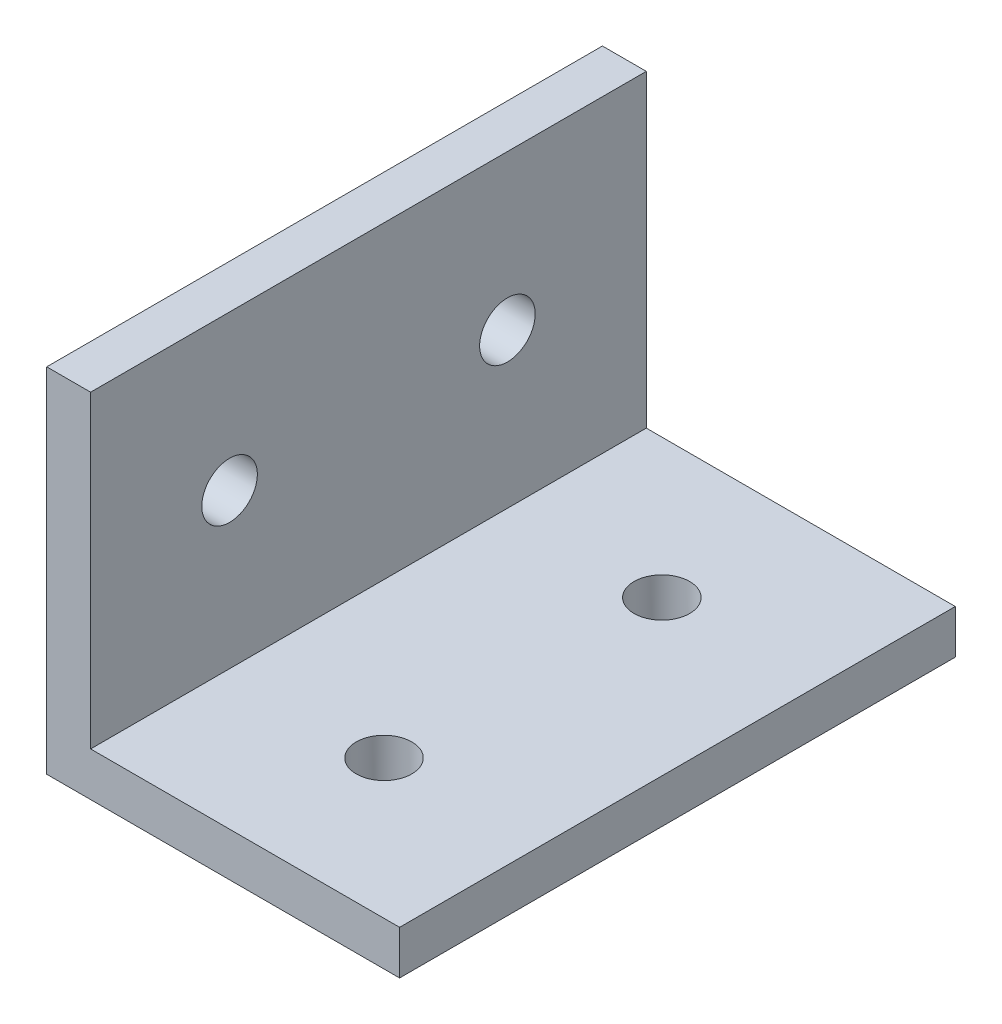
ISO-10303-21;
HEADER;
FILE_DESCRIPTION(('STEP AP214'),'2;1');
FILE_NAME('part.step','',(''),(''),'','','');
FILE_SCHEMA(('AUTOMOTIVE_DESIGN { 1 0 10303 214 1 1 1 1 }'));
ENDSEC;
DATA;
#1=APPLICATION_CONTEXT('core data for automotive mechanical design processes');
#2=APPLICATION_PROTOCOL_DEFINITION('international standard','automotive_design',2000,#1);
#3=PRODUCT_CONTEXT('',#1,'mechanical');
#4=PRODUCT('Part','Part','',(#3));
#5=PRODUCT_RELATED_PRODUCT_CATEGORY('part','',(#4));
#6=PRODUCT_DEFINITION_FORMATION('','',#4);
#7=PRODUCT_DEFINITION_CONTEXT('part definition',#1,'design');
#8=PRODUCT_DEFINITION('design','',#6,#7);
#9=PRODUCT_DEFINITION_SHAPE('','',#8);
#10=(LENGTH_UNIT() NAMED_UNIT(*) SI_UNIT(.MILLI.,.METRE.));
#11=(NAMED_UNIT(*) PLANE_ANGLE_UNIT() SI_UNIT($,.RADIAN.));
#12=(NAMED_UNIT(*) SI_UNIT($,.STERADIAN.) SOLID_ANGLE_UNIT());
#13=UNCERTAINTY_MEASURE_WITH_UNIT(LENGTH_MEASURE(1.E-05),#10,'distance_accuracy_value','');
#14=(GEOMETRIC_REPRESENTATION_CONTEXT(3) GLOBAL_UNCERTAINTY_ASSIGNED_CONTEXT((#13)) GLOBAL_UNIT_ASSIGNED_CONTEXT((#10,
#11,#12)) REPRESENTATION_CONTEXT('',''));
#15=CARTESIAN_POINT('',(0.,0.,0.));
#16=DIRECTION('',(0.,0.,1.));
#17=DIRECTION('',(1.,0.,0.));
#18=AXIS2_PLACEMENT_3D('',#15,#16,#17);
#19=CARTESIAN_POINT('',(0.,0.,20.));
#20=DIRECTION('',(0.,1.,0.));
#21=DIRECTION('',(0.,0.,1.));
#22=AXIS2_PLACEMENT_3D('',#19,#20,#21);
#23=PLANE('',#22);
#24=CARTESIAN_POINT('',(7.13999999999999,0.,5.));
#25=DIRECTION('',(0.,1.,0.));
#26=DIRECTION('',(0.,0.,1.));
#27=AXIS2_PLACEMENT_3D('',#24,#25,#26);
#28=CIRCLE('',#27,1.);
#29=CARTESIAN_POINT('',(7.13999999999999,0.,6.));
#30=VERTEX_POINT('',#29);
#31=EDGE_CURVE('E166',#30,#30,#28,.F.);
#32=ORIENTED_EDGE('',*,*,#31,.F.);
#33=EDGE_LOOP('',(#32));
#34=FACE_BOUND('',#33,.T.);
#35=CARTESIAN_POINT('',(7.13999999999999,0.,15.));
#36=DIRECTION('',(0.,1.,0.));
#37=DIRECTION('',(0.,0.,1.));
#38=AXIS2_PLACEMENT_3D('',#35,#36,#37);
#39=CIRCLE('',#38,1.);
#40=CARTESIAN_POINT('',(7.13999999999999,0.,16.));
#41=VERTEX_POINT('',#40);
#42=EDGE_CURVE('E169',#41,#41,#39,.F.);
#43=ORIENTED_EDGE('',*,*,#42,.F.);
#44=EDGE_LOOP('',(#43));
#45=FACE_BOUND('',#44,.T.);
#46=DIRECTION('',(1.,0.,0.));
#47=VECTOR('',#46,1.);
#48=CARTESIAN_POINT('',(0.,0.,0.));
#49=LINE('',#48,#47);
#50=CARTESIAN_POINT('',(0.,0.,0.));
#51=VERTEX_POINT('',#50);
#52=CARTESIAN_POINT('',(12.7,0.,0.));
#53=VERTEX_POINT('',#52);
#54=EDGE_CURVE('E120',#51,#53,#49,.T.);
#55=ORIENTED_EDGE('',*,*,#54,.T.);
#56=DIRECTION('',(0.,0.,-1.));
#57=VECTOR('',#56,1.);
#58=CARTESIAN_POINT('',(12.7,0.,20.));
#59=LINE('',#58,#57);
#60=CARTESIAN_POINT('',(12.7,0.,20.));
#61=VERTEX_POINT('',#60);
#62=EDGE_CURVE('E11',#61,#53,#59,.T.);
#63=ORIENTED_EDGE('',*,*,#62,.F.);
#64=DIRECTION('',(1.,0.,0.));
#65=VECTOR('',#64,1.);
#66=CARTESIAN_POINT('',(0.,0.,20.));
#67=LINE('',#66,#65);
#68=CARTESIAN_POINT('',(0.,0.,20.));
#69=VERTEX_POINT('',#68);
#70=EDGE_CURVE('E131',#69,#61,#67,.T.);
#71=ORIENTED_EDGE('',*,*,#70,.F.);
#72=DIRECTION('',(0.,0.,-1.));
#73=VECTOR('',#72,1.);
#74=CARTESIAN_POINT('',(0.,0.,20.));
#75=LINE('',#74,#73);
#76=EDGE_CURVE('E116',#69,#51,#75,.T.);
#77=ORIENTED_EDGE('',*,*,#76,.T.);
#78=EDGE_LOOP('',(#55,#63,#71,#77));
#79=FACE_BOUND('',#78,.T.);
#80=ADVANCED_FACE('F36',(#34,#45,#79),#23,.F.);
#81=CARTESIAN_POINT('',(12.7,1.58,20.));
#82=DIRECTION('',(-1.,0.,0.));
#83=DIRECTION('',(0.,0.,1.));
#84=AXIS2_PLACEMENT_3D('',#81,#82,#83);
#85=PLANE('',#84);
#86=DIRECTION('',(0.,1.,0.));
#87=VECTOR('',#86,1.);
#88=CARTESIAN_POINT('',(12.7,1.58,0.));
#89=LINE('',#88,#87);
#90=CARTESIAN_POINT('',(12.7,1.58,0.));
#91=VERTEX_POINT('',#90);
#92=EDGE_CURVE('E123',#53,#91,#89,.T.);
#93=ORIENTED_EDGE('',*,*,#92,.T.);
#94=DIRECTION('',(0.,0.,-1.));
#95=VECTOR('',#94,1.);
#96=CARTESIAN_POINT('',(12.7,1.58,20.));
#97=LINE('',#96,#95);
#98=CARTESIAN_POINT('',(12.7,1.58,20.));
#99=VERTEX_POINT('',#98);
#100=EDGE_CURVE('E44',#99,#91,#97,.T.);
#101=ORIENTED_EDGE('',*,*,#100,.F.);
#102=DIRECTION('',(0.,1.,0.));
#103=VECTOR('',#102,1.);
#104=CARTESIAN_POINT('',(12.7,1.58,20.));
#105=LINE('',#104,#103);
#106=EDGE_CURVE('E89',#61,#99,#105,.T.);
#107=ORIENTED_EDGE('',*,*,#106,.F.);
#108=ORIENTED_EDGE('',*,*,#62,.T.);
#109=EDGE_LOOP('',(#93,#101,#107,#108));
#110=FACE_BOUND('',#109,.T.);
#111=ADVANCED_FACE('F158',(#110),#85,.F.);
#112=CARTESIAN_POINT('',(1.58,1.58,20.));
#113=DIRECTION('',(0.,-1.,0.));
#114=DIRECTION('',(0.,0.,-1.));
#115=AXIS2_PLACEMENT_3D('',#112,#113,#114);
#116=PLANE('',#115);
#117=CARTESIAN_POINT('',(7.14,1.58,5.));
#118=DIRECTION('',(0.,-1.,0.));
#119=DIRECTION('',(0.,0.,-1.));
#120=AXIS2_PLACEMENT_3D('',#117,#118,#119);
#121=CIRCLE('',#120,1.);
#122=CARTESIAN_POINT('',(7.14,1.58,4.));
#123=VERTEX_POINT('',#122);
#124=EDGE_CURVE('E171',#123,#123,#121,.F.);
#125=ORIENTED_EDGE('',*,*,#124,.F.);
#126=EDGE_LOOP('',(#125));
#127=FACE_BOUND('',#126,.T.);
#128=CARTESIAN_POINT('',(7.14,1.58,15.));
#129=DIRECTION('',(0.,-1.,0.));
#130=DIRECTION('',(0.,0.,-1.));
#131=AXIS2_PLACEMENT_3D('',#128,#129,#130);
#132=CIRCLE('',#131,1.);
#133=CARTESIAN_POINT('',(7.14,1.58,14.));
#134=VERTEX_POINT('',#133);
#135=EDGE_CURVE('E172',#134,#134,#132,.F.);
#136=ORIENTED_EDGE('',*,*,#135,.F.);
#137=EDGE_LOOP('',(#136));
#138=FACE_BOUND('',#137,.T.);
#139=DIRECTION('',(-1.,0.,0.));
#140=VECTOR('',#139,1.);
#141=CARTESIAN_POINT('',(1.58,1.58,0.));
#142=LINE('',#141,#140);
#143=CARTESIAN_POINT('',(1.58,1.58,0.));
#144=VERTEX_POINT('',#143);
#145=EDGE_CURVE('E126',#91,#144,#142,.T.);
#146=ORIENTED_EDGE('',*,*,#145,.T.);
#147=DIRECTION('',(0.,0.,-1.));
#148=VECTOR('',#147,1.);
#149=CARTESIAN_POINT('',(1.58,1.58,20.));
#150=LINE('',#149,#148);
#151=CARTESIAN_POINT('',(1.58,1.58,20.));
#152=VERTEX_POINT('',#151);
#153=EDGE_CURVE('E111',#152,#144,#150,.T.);
#154=ORIENTED_EDGE('',*,*,#153,.F.);
#155=DIRECTION('',(-1.,0.,0.));
#156=VECTOR('',#155,1.);
#157=CARTESIAN_POINT('',(1.58,1.58,20.));
#158=LINE('',#157,#156);
#159=EDGE_CURVE('E102',#99,#152,#158,.T.);
#160=ORIENTED_EDGE('',*,*,#159,.F.);
#161=ORIENTED_EDGE('',*,*,#100,.T.);
#162=EDGE_LOOP('',(#146,#154,#160,#161));
#163=FACE_BOUND('',#162,.T.);
#164=ADVANCED_FACE('F137',(#127,#138,#163),#116,.F.);
#165=CARTESIAN_POINT('',(1.58,1.58,20.));
#166=DIRECTION('',(-1.,0.,0.));
#167=DIRECTION('',(0.,0.,1.));
#168=AXIS2_PLACEMENT_3D('',#165,#166,#167);
#169=PLANE('',#168);
#170=CARTESIAN_POINT('',(1.58,7.14,5.));
#171=DIRECTION('',(-1.,0.,0.));
#172=DIRECTION('',(0.,0.,1.));
#173=AXIS2_PLACEMENT_3D('',#170,#171,#172);
#174=CIRCLE('',#173,1.);
#175=CARTESIAN_POINT('',(1.58,7.14,6.));
#176=VERTEX_POINT('',#175);
#177=EDGE_CURVE('E124',#176,#176,#174,.F.);
#178=ORIENTED_EDGE('',*,*,#177,.F.);
#179=EDGE_LOOP('',(#178));
#180=FACE_BOUND('',#179,.T.);
#181=CARTESIAN_POINT('',(1.58,7.14,15.));
#182=DIRECTION('',(-1.,0.,0.));
#183=DIRECTION('',(0.,0.,1.));
#184=AXIS2_PLACEMENT_3D('',#181,#182,#183);
#185=CIRCLE('',#184,1.);
#186=CARTESIAN_POINT('',(1.58,7.14,16.));
#187=VERTEX_POINT('',#186);
#188=EDGE_CURVE('E183',#187,#187,#185,.F.);
#189=ORIENTED_EDGE('',*,*,#188,.F.);
#190=EDGE_LOOP('',(#189));
#191=FACE_BOUND('',#190,.T.);
#192=DIRECTION('',(0.,1.,0.));
#193=VECTOR('',#192,1.);
#194=CARTESIAN_POINT('',(1.58,1.58,0.));
#195=LINE('',#194,#193);
#196=CARTESIAN_POINT('',(1.58,12.7,0.));
#197=VERTEX_POINT('',#196);
#198=EDGE_CURVE('E110',#144,#197,#195,.T.);
#199=ORIENTED_EDGE('',*,*,#198,.T.);
#200=DIRECTION('',(0.,0.,-1.));
#201=VECTOR('',#200,1.);
#202=CARTESIAN_POINT('',(1.58,12.7,20.));
#203=LINE('',#202,#201);
#204=CARTESIAN_POINT('',(1.58,12.7,20.));
#205=VERTEX_POINT('',#204);
#206=EDGE_CURVE('E107',#205,#197,#203,.T.);
#207=ORIENTED_EDGE('',*,*,#206,.F.);
#208=DIRECTION('',(0.,1.,0.));
#209=VECTOR('',#208,1.);
#210=CARTESIAN_POINT('',(1.58,1.58,20.));
#211=LINE('',#210,#209);
#212=EDGE_CURVE('E96',#152,#205,#211,.T.);
#213=ORIENTED_EDGE('',*,*,#212,.F.);
#214=ORIENTED_EDGE('',*,*,#153,.T.);
#215=EDGE_LOOP('',(#199,#207,#213,#214));
#216=FACE_BOUND('',#215,.T.);
#217=ADVANCED_FACE('F108',(#180,#191,#216),#169,.F.);
#218=CARTESIAN_POINT('',(0.,12.7,20.));
#219=DIRECTION('',(0.,-1.,0.));
#220=DIRECTION('',(0.,0.,-1.));
#221=AXIS2_PLACEMENT_3D('',#218,#219,#220);
#222=PLANE('',#221);
#223=DIRECTION('',(-1.,0.,0.));
#224=VECTOR('',#223,1.);
#225=CARTESIAN_POINT('',(0.,12.7,0.));
#226=LINE('',#225,#224);
#227=CARTESIAN_POINT('',(0.,12.7,0.));
#228=VERTEX_POINT('',#227);
#229=EDGE_CURVE('E75',#197,#228,#226,.T.);
#230=ORIENTED_EDGE('',*,*,#229,.T.);
#231=DIRECTION('',(0.,0.,-1.));
#232=VECTOR('',#231,1.);
#233=CARTESIAN_POINT('',(0.,12.7,20.));
#234=LINE('',#233,#232);
#235=CARTESIAN_POINT('',(0.,12.7,20.));
#236=VERTEX_POINT('',#235);
#237=EDGE_CURVE('E112',#236,#228,#234,.T.);
#238=ORIENTED_EDGE('',*,*,#237,.F.);
#239=DIRECTION('',(-1.,0.,0.));
#240=VECTOR('',#239,1.);
#241=CARTESIAN_POINT('',(0.,12.7,20.));
#242=LINE('',#241,#240);
#243=EDGE_CURVE('E100',#205,#236,#242,.T.);
#244=ORIENTED_EDGE('',*,*,#243,.F.);
#245=ORIENTED_EDGE('',*,*,#206,.T.);
#246=EDGE_LOOP('',(#230,#238,#244,#245));
#247=FACE_BOUND('',#246,.T.);
#248=ADVANCED_FACE('F114',(#247),#222,.F.);
#249=CARTESIAN_POINT('',(0.,0.,20.));
#250=DIRECTION('',(1.,0.,0.));
#251=DIRECTION('',(0.,0.,-1.));
#252=AXIS2_PLACEMENT_3D('',#249,#250,#251);
#253=PLANE('',#252);
#254=CARTESIAN_POINT('',(0.,7.14,5.));
#255=DIRECTION('',(-1.,0.,0.));
#256=DIRECTION('',(0.,0.,1.));
#257=AXIS2_PLACEMENT_3D('',#254,#255,#256);
#258=CIRCLE('',#257,1.);
#259=CARTESIAN_POINT('',(0.,7.14,6.));
#260=VERTEX_POINT('',#259);
#261=EDGE_CURVE('E180',#260,#260,#258,.T.);
#262=ORIENTED_EDGE('',*,*,#261,.F.);
#263=EDGE_LOOP('',(#262));
#264=FACE_BOUND('',#263,.T.);
#265=CARTESIAN_POINT('',(0.,7.14,15.));
#266=DIRECTION('',(-1.,0.,0.));
#267=DIRECTION('',(0.,0.,1.));
#268=AXIS2_PLACEMENT_3D('',#265,#266,#267);
#269=CIRCLE('',#268,1.);
#270=CARTESIAN_POINT('',(0.,7.14,16.));
#271=VERTEX_POINT('',#270);
#272=EDGE_CURVE('E186',#271,#271,#269,.T.);
#273=ORIENTED_EDGE('',*,*,#272,.F.);
#274=EDGE_LOOP('',(#273));
#275=FACE_BOUND('',#274,.T.);
#276=DIRECTION('',(0.,-1.,0.));
#277=VECTOR('',#276,1.);
#278=CARTESIAN_POINT('',(0.,0.,0.));
#279=LINE('',#278,#277);
#280=EDGE_CURVE('E81',#228,#51,#279,.T.);
#281=ORIENTED_EDGE('',*,*,#280,.T.);
#282=ORIENTED_EDGE('',*,*,#76,.F.);
#283=DIRECTION('',(0.,-1.,0.));
#284=VECTOR('',#283,1.);
#285=CARTESIAN_POINT('',(0.,0.,20.));
#286=LINE('',#285,#284);
#287=EDGE_CURVE('E52',#236,#69,#286,.T.);
#288=ORIENTED_EDGE('',*,*,#287,.F.);
#289=ORIENTED_EDGE('',*,*,#237,.T.);
#290=EDGE_LOOP('',(#281,#282,#288,#289));
#291=FACE_BOUND('',#290,.T.);
#292=ADVANCED_FACE('F144',(#264,#275,#291),#253,.F.);
#293=CARTESIAN_POINT('',(0.,0.,20.));
#294=DIRECTION('',(0.,0.,-1.));
#295=DIRECTION('',(-1.,0.,0.));
#296=AXIS2_PLACEMENT_3D('',#293,#294,#295);
#297=PLANE('',#296);
#298=ORIENTED_EDGE('',*,*,#70,.T.);
#299=ORIENTED_EDGE('',*,*,#106,.T.);
#300=ORIENTED_EDGE('',*,*,#159,.T.);
#301=ORIENTED_EDGE('',*,*,#212,.T.);
#302=ORIENTED_EDGE('',*,*,#243,.T.);
#303=ORIENTED_EDGE('',*,*,#287,.T.);
#304=EDGE_LOOP('',(#298,#299,#300,#301,#302,#303));
#305=FACE_BOUND('',#304,.T.);
#306=ADVANCED_FACE('F98',(#305),#297,.F.);
#307=CARTESIAN_POINT('',(0.,0.,0.));
#308=DIRECTION('',(0.,0.,-1.));
#309=DIRECTION('',(-1.,0.,0.));
#310=AXIS2_PLACEMENT_3D('',#307,#308,#309);
#311=PLANE('',#310);
#312=ORIENTED_EDGE('',*,*,#54,.F.);
#313=ORIENTED_EDGE('',*,*,#280,.F.);
#314=ORIENTED_EDGE('',*,*,#229,.F.);
#315=ORIENTED_EDGE('',*,*,#198,.F.);
#316=ORIENTED_EDGE('',*,*,#145,.F.);
#317=ORIENTED_EDGE('',*,*,#92,.F.);
#318=EDGE_LOOP('',(#312,#313,#314,#315,#316,#317));
#319=FACE_BOUND('',#318,.T.);
#320=ADVANCED_FACE('F140',(#319),#311,.T.);
#321=CARTESIAN_POINT('',(12.701,7.14,15.));
#322=DIRECTION('',(-1.,0.,0.));
#323=DIRECTION('',(0.,0.,1.));
#324=AXIS2_PLACEMENT_3D('',#321,#322,#323);
#325=CYLINDRICAL_SURFACE('',#324,1.);
#326=ORIENTED_EDGE('',*,*,#272,.T.);
#327=EDGE_LOOP('',(#326));
#328=FACE_BOUND('',#327,.T.);
#329=ORIENTED_EDGE('',*,*,#188,.T.);
#330=EDGE_LOOP('',(#329));
#331=FACE_BOUND('',#330,.T.);
#332=ADVANCED_FACE('F194',(#328,#331),#325,.F.);
#333=CARTESIAN_POINT('',(12.701,7.14,5.));
#334=DIRECTION('',(-1.,0.,0.));
#335=DIRECTION('',(0.,0.,1.));
#336=AXIS2_PLACEMENT_3D('',#333,#334,#335);
#337=CYLINDRICAL_SURFACE('',#336,1.);
#338=ORIENTED_EDGE('',*,*,#261,.T.);
#339=EDGE_LOOP('',(#338));
#340=FACE_BOUND('',#339,.T.);
#341=ORIENTED_EDGE('',*,*,#177,.T.);
#342=EDGE_LOOP('',(#341));
#343=FACE_BOUND('',#342,.T.);
#344=ADVANCED_FACE('F206',(#340,#343),#337,.F.);
#345=CARTESIAN_POINT('',(7.13999999999999,-0.00100000000002485,15.));
#346=DIRECTION('',(0.,1.,0.));
#347=DIRECTION('',(-1.,0.,0.));
#348=AXIS2_PLACEMENT_3D('',#345,#346,#347);
#349=CYLINDRICAL_SURFACE('',#348,1.);
#350=ORIENTED_EDGE('',*,*,#135,.T.);
#351=EDGE_LOOP('',(#350));
#352=FACE_BOUND('',#351,.T.);
#353=ORIENTED_EDGE('',*,*,#42,.T.);
#354=EDGE_LOOP('',(#353));
#355=FACE_BOUND('',#354,.T.);
#356=ADVANCED_FACE('F208',(#352,#355),#349,.F.);
#357=CARTESIAN_POINT('',(7.13999999999999,-0.00100000000002485,5.));
#358=DIRECTION('',(0.,1.,0.));
#359=DIRECTION('',(-1.,0.,0.));
#360=AXIS2_PLACEMENT_3D('',#357,#358,#359);
#361=CYLINDRICAL_SURFACE('',#360,1.);
#362=ORIENTED_EDGE('',*,*,#124,.T.);
#363=EDGE_LOOP('',(#362));
#364=FACE_BOUND('',#363,.T.);
#365=ORIENTED_EDGE('',*,*,#31,.T.);
#366=EDGE_LOOP('',(#365));
#367=FACE_BOUND('',#366,.T.);
#368=ADVANCED_FACE('F215',(#364,#367),#361,.F.);
#369=CLOSED_SHELL('',(#80,#111,#164,#217,#248,#292,#306,#320,#332,#344,#356,#368));
#370=MANIFOLD_SOLID_BREP('B2',#369);
#371=ADVANCED_BREP_SHAPE_REPRESENTATION('',(#18,#370),#14);
#372=SHAPE_DEFINITION_REPRESENTATION(#9,#371);
ENDSEC;
END-ISO-10303-21;
